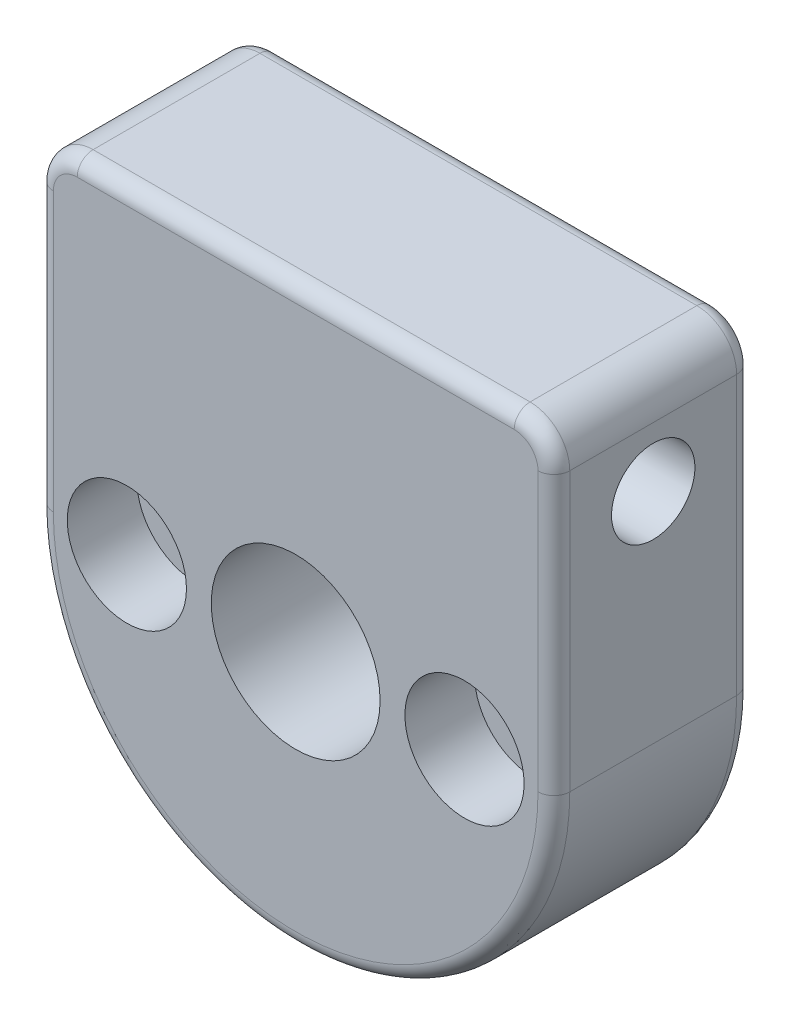
ISO-10303-21;
HEADER;
FILE_DESCRIPTION(('STEP AP214'),'2;1');
FILE_NAME('part.step','',(''),(''),'','','');
FILE_SCHEMA(('AUTOMOTIVE_DESIGN { 1 0 10303 214 1 1 1 1 }'));
ENDSEC;
DATA;
#1=APPLICATION_CONTEXT('core data for automotive mechanical design processes');
#2=APPLICATION_PROTOCOL_DEFINITION('international standard','automotive_design',2000,#1);
#3=PRODUCT_CONTEXT('',#1,'mechanical');
#4=PRODUCT('Part','Part','',(#3));
#5=PRODUCT_RELATED_PRODUCT_CATEGORY('part','',(#4));
#6=PRODUCT_DEFINITION_FORMATION('','',#4);
#7=PRODUCT_DEFINITION_CONTEXT('part definition',#1,'design');
#8=PRODUCT_DEFINITION('design','',#6,#7);
#9=PRODUCT_DEFINITION_SHAPE('','',#8);
#10=(LENGTH_UNIT() NAMED_UNIT(*) SI_UNIT(.MILLI.,.METRE.));
#11=(NAMED_UNIT(*) PLANE_ANGLE_UNIT() SI_UNIT($,.RADIAN.));
#12=(NAMED_UNIT(*) SI_UNIT($,.STERADIAN.) SOLID_ANGLE_UNIT());
#13=UNCERTAINTY_MEASURE_WITH_UNIT(LENGTH_MEASURE(1.E-05),#10,'distance_accuracy_value','');
#14=(GEOMETRIC_REPRESENTATION_CONTEXT(3) GLOBAL_UNCERTAINTY_ASSIGNED_CONTEXT((#13)) GLOBAL_UNIT_ASSIGNED_CONTEXT((#10,
#11,#12)) REPRESENTATION_CONTEXT('',''));
#15=CARTESIAN_POINT('',(0.,0.,0.));
#16=DIRECTION('',(0.,0.,1.));
#17=DIRECTION('',(1.,0.,0.));
#18=AXIS2_PLACEMENT_3D('',#15,#16,#17);
#19=CARTESIAN_POINT('',(-8.5,0.,10.));
#20=DIRECTION('',(0.,0.,-1.));
#21=DIRECTION('',(-1.,0.,0.));
#22=AXIS2_PLACEMENT_3D('',#19,#20,#21);
#23=CYLINDRICAL_SURFACE('',#22,1.6);
#24=CARTESIAN_POINT('',(-8.5,0.,0.));
#25=DIRECTION('',(0.,0.,1.));
#26=DIRECTION('',(1.,0.,0.));
#27=AXIS2_PLACEMENT_3D('',#24,#25,#26);
#28=CIRCLE('',#27,1.6);
#29=CARTESIAN_POINT('',(-6.9,0.,0.));
#30=VERTEX_POINT('',#29);
#31=EDGE_CURVE('E147',#30,#30,#28,.T.);
#32=ORIENTED_EDGE('',*,*,#31,.F.);
#33=EDGE_LOOP('',(#32));
#34=FACE_BOUND('',#33,.T.);
#35=CARTESIAN_POINT('',(-8.5,0.,6.5));
#36=DIRECTION('',(0.,0.,1.));
#37=DIRECTION('',(1.,0.,0.));
#38=AXIS2_PLACEMENT_3D('',#35,#36,#37);
#39=CIRCLE('',#38,1.6);
#40=CARTESIAN_POINT('',(-6.9,0.,6.5));
#41=VERTEX_POINT('',#40);
#42=EDGE_CURVE('E234',#41,#41,#39,.T.);
#43=ORIENTED_EDGE('',*,*,#42,.T.);
#44=EDGE_LOOP('',(#43));
#45=FACE_BOUND('',#44,.T.);
#46=ADVANCED_FACE('F34',(#34,#45),#23,.F.);
#47=CARTESIAN_POINT('',(8.5,0.,10.));
#48=DIRECTION('',(0.,0.,-1.));
#49=DIRECTION('',(-1.,0.,0.));
#50=AXIS2_PLACEMENT_3D('',#47,#48,#49);
#51=CYLINDRICAL_SURFACE('',#50,1.6);
#52=CARTESIAN_POINT('',(8.5,0.,0.));
#53=DIRECTION('',(0.,0.,1.));
#54=DIRECTION('',(-1.,0.,0.));
#55=AXIS2_PLACEMENT_3D('',#52,#53,#54);
#56=CIRCLE('',#55,1.6);
#57=CARTESIAN_POINT('',(6.9,0.,0.));
#58=VERTEX_POINT('',#57);
#59=EDGE_CURVE('E230',#58,#58,#56,.T.);
#60=ORIENTED_EDGE('',*,*,#59,.F.);
#61=EDGE_LOOP('',(#60));
#62=FACE_BOUND('',#61,.T.);
#63=CARTESIAN_POINT('',(8.5,0.,6.5));
#64=DIRECTION('',(0.,0.,1.));
#65=DIRECTION('',(1.,0.,0.));
#66=AXIS2_PLACEMENT_3D('',#63,#64,#65);
#67=CIRCLE('',#66,1.6);
#68=CARTESIAN_POINT('',(10.1,0.,6.5));
#69=VERTEX_POINT('',#68);
#70=EDGE_CURVE('E218',#69,#69,#67,.T.);
#71=ORIENTED_EDGE('',*,*,#70,.T.);
#72=EDGE_LOOP('',(#71));
#73=FACE_BOUND('',#72,.T.);
#74=ADVANCED_FACE('F329',(#62,#73),#51,.F.);
#75=CARTESIAN_POINT('',(0.,0.,10.));
#76=DIRECTION('',(0.,0.,1.));
#77=DIRECTION('',(1.,0.,0.));
#78=AXIS2_PLACEMENT_3D('',#75,#76,#77);
#79=PLANE('',#78);
#80=DIRECTION('',(0.,-1.,0.));
#81=VECTOR('',#80,1.);
#82=CARTESIAN_POINT('',(-12.2,0.,10.));
#83=LINE('',#82,#81);
#84=CARTESIAN_POINT('',(-12.2,14.,10.));
#85=VERTEX_POINT('',#84);
#86=CARTESIAN_POINT('',(-12.2,0.,10.));
#87=VERTEX_POINT('',#86);
#88=EDGE_CURVE('E51',#85,#87,#83,.T.);
#89=ORIENTED_EDGE('',*,*,#88,.T.);
#90=CARTESIAN_POINT('',(0.,0.,10.));
#91=DIRECTION('',(0.,0.,1.));
#92=DIRECTION('',(1.,0.,0.));
#93=AXIS2_PLACEMENT_3D('',#90,#91,#92);
#94=CIRCLE('',#93,12.2);
#95=CARTESIAN_POINT('',(12.2,0.,10.));
#96=VERTEX_POINT('',#95);
#97=EDGE_CURVE('E134',#87,#96,#94,.T.);
#98=ORIENTED_EDGE('',*,*,#97,.T.);
#99=DIRECTION('',(0.,1.,0.));
#100=VECTOR('',#99,1.);
#101=CARTESIAN_POINT('',(12.2,14.,10.));
#102=LINE('',#101,#100);
#103=CARTESIAN_POINT('',(12.2,14.,10.));
#104=VERTEX_POINT('',#103);
#105=EDGE_CURVE('E159',#96,#104,#102,.T.);
#106=ORIENTED_EDGE('',*,*,#105,.T.);
#107=CARTESIAN_POINT('',(11.,14.,10.));
#108=DIRECTION('',(0.,0.,1.));
#109=DIRECTION('',(1.,0.,0.));
#110=AXIS2_PLACEMENT_3D('',#107,#108,#109);
#111=CIRCLE('',#110,1.2);
#112=CARTESIAN_POINT('',(11.,15.2,10.));
#113=VERTEX_POINT('',#112);
#114=EDGE_CURVE('E284',#104,#113,#111,.T.);
#115=ORIENTED_EDGE('',*,*,#114,.T.);
#116=DIRECTION('',(-1.,0.,0.));
#117=VECTOR('',#116,1.);
#118=CARTESIAN_POINT('',(-11.,15.2,10.));
#119=LINE('',#118,#117);
#120=CARTESIAN_POINT('',(-11.,15.2,10.));
#121=VERTEX_POINT('',#120);
#122=EDGE_CURVE('E286',#113,#121,#119,.T.);
#123=ORIENTED_EDGE('',*,*,#122,.T.);
#124=CARTESIAN_POINT('',(-11.,14.,10.));
#125=DIRECTION('',(0.,0.,1.));
#126=DIRECTION('',(1.,0.,0.));
#127=AXIS2_PLACEMENT_3D('',#124,#125,#126);
#128=CIRCLE('',#127,1.2);
#129=EDGE_CURVE('E56',#121,#85,#128,.T.);
#130=ORIENTED_EDGE('',*,*,#129,.T.);
#131=EDGE_LOOP('',(#89,#98,#106,#115,#123,#130));
#132=FACE_BOUND('',#131,.T.);
#133=CARTESIAN_POINT('',(-8.5,0.,10.));
#134=DIRECTION('',(0.,0.,1.));
#135=DIRECTION('',(1.,0.,0.));
#136=AXIS2_PLACEMENT_3D('',#133,#134,#135);
#137=CIRCLE('',#136,3.);
#138=CARTESIAN_POINT('',(-5.5,0.,10.));
#139=VERTEX_POINT('',#138);
#140=EDGE_CURVE('E219',#139,#139,#137,.T.);
#141=ORIENTED_EDGE('',*,*,#140,.F.);
#142=EDGE_LOOP('',(#141));
#143=FACE_BOUND('',#142,.T.);
#144=CARTESIAN_POINT('',(8.5,0.,10.));
#145=DIRECTION('',(0.,0.,1.));
#146=DIRECTION('',(1.,0.,0.));
#147=AXIS2_PLACEMENT_3D('',#144,#145,#146);
#148=CIRCLE('',#147,3.);
#149=CARTESIAN_POINT('',(11.5,0.,10.));
#150=VERTEX_POINT('',#149);
#151=EDGE_CURVE('E212',#150,#150,#148,.T.);
#152=ORIENTED_EDGE('',*,*,#151,.F.);
#153=EDGE_LOOP('',(#152));
#154=FACE_BOUND('',#153,.T.);
#155=CARTESIAN_POINT('',(0.,0.,10.));
#156=DIRECTION('',(0.,0.,1.));
#157=DIRECTION('',(1.,0.,0.));
#158=AXIS2_PLACEMENT_3D('',#155,#156,#157);
#159=CIRCLE('',#158,4.25);
#160=CARTESIAN_POINT('',(4.25,0.,10.));
#161=VERTEX_POINT('',#160);
#162=EDGE_CURVE('E227',#161,#161,#159,.T.);
#163=ORIENTED_EDGE('',*,*,#162,.F.);
#164=EDGE_LOOP('',(#163));
#165=FACE_BOUND('',#164,.T.);
#166=ADVANCED_FACE('F290',(#132,#143,#154,#165),#79,.T.);
#167=CARTESIAN_POINT('',(0.,0.,0.));
#168=DIRECTION('',(0.,0.,1.));
#169=DIRECTION('',(1.,0.,0.));
#170=AXIS2_PLACEMENT_3D('',#167,#168,#169);
#171=PLANE('',#170);
#172=DIRECTION('',(0.,1.,0.));
#173=VECTOR('',#172,1.);
#174=CARTESIAN_POINT('',(12.2,0.,0.));
#175=LINE('',#174,#173);
#176=CARTESIAN_POINT('',(12.2,14.,0.));
#177=VERTEX_POINT('',#176);
#178=CARTESIAN_POINT('',(12.2,0.,0.));
#179=VERTEX_POINT('',#178);
#180=EDGE_CURVE('E254',#177,#179,#175,.F.);
#181=ORIENTED_EDGE('',*,*,#180,.T.);
#182=CARTESIAN_POINT('',(0.,0.,0.));
#183=DIRECTION('',(0.,0.,1.));
#184=DIRECTION('',(1.,0.,0.));
#185=AXIS2_PLACEMENT_3D('',#182,#183,#184);
#186=CIRCLE('',#185,12.2);
#187=CARTESIAN_POINT('',(-12.2,0.,0.));
#188=VERTEX_POINT('',#187);
#189=EDGE_CURVE('E264',#179,#188,#186,.F.);
#190=ORIENTED_EDGE('',*,*,#189,.T.);
#191=DIRECTION('',(0.,-1.,0.));
#192=VECTOR('',#191,1.);
#193=CARTESIAN_POINT('',(-12.2,0.,0.));
#194=LINE('',#193,#192);
#195=CARTESIAN_POINT('',(-12.2,14.,0.));
#196=VERTEX_POINT('',#195);
#197=EDGE_CURVE('E262',#188,#196,#194,.F.);
#198=ORIENTED_EDGE('',*,*,#197,.T.);
#199=CARTESIAN_POINT('',(-11.,14.,0.));
#200=DIRECTION('',(0.,0.,1.));
#201=DIRECTION('',(1.,0.,0.));
#202=AXIS2_PLACEMENT_3D('',#199,#200,#201);
#203=CIRCLE('',#202,1.2);
#204=CARTESIAN_POINT('',(-11.,15.2,0.));
#205=VERTEX_POINT('',#204);
#206=EDGE_CURVE('E260',#196,#205,#203,.F.);
#207=ORIENTED_EDGE('',*,*,#206,.T.);
#208=DIRECTION('',(-1.,0.,0.));
#209=VECTOR('',#208,1.);
#210=CARTESIAN_POINT('',(0.,15.2,0.));
#211=LINE('',#210,#209);
#212=CARTESIAN_POINT('',(11.,15.2,0.));
#213=VERTEX_POINT('',#212);
#214=EDGE_CURVE('E258',#205,#213,#211,.F.);
#215=ORIENTED_EDGE('',*,*,#214,.T.);
#216=CARTESIAN_POINT('',(11.,14.,0.));
#217=DIRECTION('',(0.,0.,1.));
#218=DIRECTION('',(1.,0.,0.));
#219=AXIS2_PLACEMENT_3D('',#216,#217,#218);
#220=CIRCLE('',#219,1.2);
#221=EDGE_CURVE('E256',#213,#177,#220,.F.);
#222=ORIENTED_EDGE('',*,*,#221,.T.);
#223=EDGE_LOOP('',(#181,#190,#198,#207,#215,#222));
#224=FACE_BOUND('',#223,.T.);
#225=ORIENTED_EDGE('',*,*,#31,.T.);
#226=EDGE_LOOP('',(#225));
#227=FACE_BOUND('',#226,.T.);
#228=ORIENTED_EDGE('',*,*,#59,.T.);
#229=EDGE_LOOP('',(#228));
#230=FACE_BOUND('',#229,.T.);
#231=CARTESIAN_POINT('',(0.,0.,0.));
#232=DIRECTION('',(0.,0.,1.));
#233=DIRECTION('',(1.,0.,0.));
#234=AXIS2_PLACEMENT_3D('',#231,#232,#233);
#235=CIRCLE('',#234,4.25);
#236=CARTESIAN_POINT('',(4.25,0.,0.));
#237=VERTEX_POINT('',#236);
#238=EDGE_CURVE('E231',#237,#237,#235,.T.);
#239=ORIENTED_EDGE('',*,*,#238,.T.);
#240=EDGE_LOOP('',(#239));
#241=FACE_BOUND('',#240,.T.);
#242=ADVANCED_FACE('F343',(#224,#227,#230,#241),#171,.F.);
#243=CARTESIAN_POINT('',(-13.,16.,10.));
#244=DIRECTION('',(1.,0.,0.));
#245=DIRECTION('',(0.,1.,0.));
#246=AXIS2_PLACEMENT_3D('',#243,#244,#245);
#247=PLANE('',#246);
#248=CARTESIAN_POINT('',(-13.,11.,5.));
#249=DIRECTION('',(-1.,0.,0.));
#250=DIRECTION('',(0.,-1.,0.));
#251=AXIS2_PLACEMENT_3D('',#248,#249,#250);
#252=CIRCLE('',#251,2.1);
#253=CARTESIAN_POINT('',(-13.,8.9,5.));
#254=VERTEX_POINT('',#253);
#255=EDGE_CURVE('E201',#254,#254,#252,.T.);
#256=ORIENTED_EDGE('',*,*,#255,.F.);
#257=EDGE_LOOP('',(#256));
#258=FACE_BOUND('',#257,.T.);
#259=DIRECTION('',(0.,0.,-1.));
#260=VECTOR('',#259,1.);
#261=CARTESIAN_POINT('',(-13.,14.,10.));
#262=LINE('',#261,#260);
#263=CARTESIAN_POINT('',(-13.,14.,9.2));
#264=VERTEX_POINT('',#263);
#265=CARTESIAN_POINT('',(-13.,14.,0.8));
#266=VERTEX_POINT('',#265);
#267=EDGE_CURVE('E156',#264,#266,#262,.T.);
#268=ORIENTED_EDGE('',*,*,#267,.T.);
#269=DIRECTION('',(0.,-1.,0.));
#270=VECTOR('',#269,1.);
#271=CARTESIAN_POINT('',(-13.,16.,0.8));
#272=LINE('',#271,#270);
#273=CARTESIAN_POINT('',(-13.,0.,0.8));
#274=VERTEX_POINT('',#273);
#275=EDGE_CURVE('E269',#266,#274,#272,.T.);
#276=ORIENTED_EDGE('',*,*,#275,.T.);
#277=DIRECTION('',(0.,0.,-1.));
#278=VECTOR('',#277,1.);
#279=CARTESIAN_POINT('',(-13.,0.,10.));
#280=LINE('',#279,#278);
#281=CARTESIAN_POINT('',(-13.,0.,9.2));
#282=VERTEX_POINT('',#281);
#283=EDGE_CURVE('E146',#282,#274,#280,.T.);
#284=ORIENTED_EDGE('',*,*,#283,.F.);
#285=DIRECTION('',(0.,-1.,0.));
#286=VECTOR('',#285,1.);
#287=CARTESIAN_POINT('',(-13.,14.,9.2));
#288=LINE('',#287,#286);
#289=EDGE_CURVE('E267',#282,#264,#288,.F.);
#290=ORIENTED_EDGE('',*,*,#289,.T.);
#291=EDGE_LOOP('',(#268,#276,#284,#290));
#292=FACE_BOUND('',#291,.T.);
#293=ADVANCED_FACE('F306',(#258,#292),#247,.F.);
#294=CARTESIAN_POINT('',(0.,0.,10.));
#295=DIRECTION('',(0.,0.,-1.));
#296=DIRECTION('',(-1.,0.,0.));
#297=AXIS2_PLACEMENT_3D('',#294,#295,#296);
#298=CYLINDRICAL_SURFACE('',#297,13.);
#299=ORIENTED_EDGE('',*,*,#283,.T.);
#300=CARTESIAN_POINT('',(0.,0.,0.8));
#301=DIRECTION('',(0.,0.,1.));
#302=DIRECTION('',(1.,0.,0.));
#303=AXIS2_PLACEMENT_3D('',#300,#301,#302);
#304=CIRCLE('',#303,13.);
#305=CARTESIAN_POINT('',(13.,0.,0.8));
#306=VERTEX_POINT('',#305);
#307=EDGE_CURVE('E145',#274,#306,#304,.T.);
#308=ORIENTED_EDGE('',*,*,#307,.T.);
#309=DIRECTION('',(0.,0.,-1.));
#310=VECTOR('',#309,1.);
#311=CARTESIAN_POINT('',(13.,0.,10.));
#312=LINE('',#311,#310);
#313=CARTESIAN_POINT('',(13.,0.,9.2));
#314=VERTEX_POINT('',#313);
#315=EDGE_CURVE('E127',#314,#306,#312,.T.);
#316=ORIENTED_EDGE('',*,*,#315,.F.);
#317=CARTESIAN_POINT('',(0.,0.,9.2));
#318=DIRECTION('',(0.,0.,1.));
#319=DIRECTION('',(1.,0.,0.));
#320=AXIS2_PLACEMENT_3D('',#317,#318,#319);
#321=CIRCLE('',#320,13.);
#322=EDGE_CURVE('E142',#314,#282,#321,.F.);
#323=ORIENTED_EDGE('',*,*,#322,.T.);
#324=EDGE_LOOP('',(#299,#308,#316,#323));
#325=FACE_BOUND('',#324,.T.);
#326=ADVANCED_FACE('F141',(#325),#298,.T.);
#327=CARTESIAN_POINT('',(13.,16.,10.));
#328=DIRECTION('',(-1.,0.,0.));
#329=DIRECTION('',(0.,-1.,0.));
#330=AXIS2_PLACEMENT_3D('',#327,#328,#329);
#331=PLANE('',#330);
#332=CARTESIAN_POINT('',(13.,11.,5.));
#333=DIRECTION('',(-1.,0.,0.));
#334=DIRECTION('',(0.,-1.,0.));
#335=AXIS2_PLACEMENT_3D('',#332,#333,#334);
#336=CIRCLE('',#335,2.1);
#337=CARTESIAN_POINT('',(13.,8.9,5.));
#338=VERTEX_POINT('',#337);
#339=EDGE_CURVE('E207',#338,#338,#336,.T.);
#340=ORIENTED_EDGE('',*,*,#339,.T.);
#341=EDGE_LOOP('',(#340));
#342=FACE_BOUND('',#341,.T.);
#343=ORIENTED_EDGE('',*,*,#315,.T.);
#344=DIRECTION('',(0.,1.,0.));
#345=VECTOR('',#344,1.);
#346=CARTESIAN_POINT('',(13.,16.,0.8));
#347=LINE('',#346,#345);
#348=CARTESIAN_POINT('',(13.,14.,0.8));
#349=VERTEX_POINT('',#348);
#350=EDGE_CURVE('E11',#306,#349,#347,.T.);
#351=ORIENTED_EDGE('',*,*,#350,.T.);
#352=DIRECTION('',(0.,0.,-1.));
#353=VECTOR('',#352,1.);
#354=CARTESIAN_POINT('',(13.,14.,10.));
#355=LINE('',#354,#353);
#356=CARTESIAN_POINT('',(13.,14.,9.2));
#357=VERTEX_POINT('',#356);
#358=EDGE_CURVE('E129',#349,#357,#355,.F.);
#359=ORIENTED_EDGE('',*,*,#358,.T.);
#360=DIRECTION('',(0.,1.,0.));
#361=VECTOR('',#360,1.);
#362=CARTESIAN_POINT('',(13.,0.,9.2));
#363=LINE('',#362,#361);
#364=EDGE_CURVE('E43',#357,#314,#363,.F.);
#365=ORIENTED_EDGE('',*,*,#364,.T.);
#366=EDGE_LOOP('',(#343,#351,#359,#365));
#367=FACE_BOUND('',#366,.T.);
#368=ADVANCED_FACE('F126',(#342,#367),#331,.F.);
#369=CARTESIAN_POINT('',(-13.,16.,10.));
#370=DIRECTION('',(0.,-1.,0.));
#371=DIRECTION('',(0.,0.,-1.));
#372=AXIS2_PLACEMENT_3D('',#369,#370,#371);
#373=PLANE('',#372);
#374=DIRECTION('',(0.,0.,-1.));
#375=VECTOR('',#374,1.);
#376=CARTESIAN_POINT('',(11.,16.,10.));
#377=LINE('',#376,#375);
#378=CARTESIAN_POINT('',(11.,16.,9.2));
#379=VERTEX_POINT('',#378);
#380=CARTESIAN_POINT('',(11.,16.,0.8));
#381=VERTEX_POINT('',#380);
#382=EDGE_CURVE('E247',#379,#381,#377,.T.);
#383=ORIENTED_EDGE('',*,*,#382,.T.);
#384=DIRECTION('',(-1.,0.,0.));
#385=VECTOR('',#384,1.);
#386=CARTESIAN_POINT('',(-13.,16.,0.8));
#387=LINE('',#386,#385);
#388=CARTESIAN_POINT('',(-11.,16.,0.8));
#389=VERTEX_POINT('',#388);
#390=EDGE_CURVE('E277',#381,#389,#387,.T.);
#391=ORIENTED_EDGE('',*,*,#390,.T.);
#392=DIRECTION('',(0.,0.,-1.));
#393=VECTOR('',#392,1.);
#394=CARTESIAN_POINT('',(-11.,16.,10.));
#395=LINE('',#394,#393);
#396=CARTESIAN_POINT('',(-11.,16.,9.2));
#397=VERTEX_POINT('',#396);
#398=EDGE_CURVE('E240',#389,#397,#395,.F.);
#399=ORIENTED_EDGE('',*,*,#398,.T.);
#400=DIRECTION('',(-1.,0.,0.));
#401=VECTOR('',#400,1.);
#402=CARTESIAN_POINT('',(11.,16.,9.2));
#403=LINE('',#402,#401);
#404=EDGE_CURVE('E275',#397,#379,#403,.F.);
#405=ORIENTED_EDGE('',*,*,#404,.T.);
#406=EDGE_LOOP('',(#383,#391,#399,#405));
#407=FACE_BOUND('',#406,.T.);
#408=ADVANCED_FACE('F347',(#407),#373,.F.);
#409=CARTESIAN_POINT('',(0.,0.,10.));
#410=DIRECTION('',(0.,0.,-1.));
#411=DIRECTION('',(-1.,0.,0.));
#412=AXIS2_PLACEMENT_3D('',#409,#410,#411);
#413=CYLINDRICAL_SURFACE('',#412,4.25);
#414=ORIENTED_EDGE('',*,*,#162,.T.);
#415=EDGE_LOOP('',(#414));
#416=FACE_BOUND('',#415,.T.);
#417=ORIENTED_EDGE('',*,*,#238,.F.);
#418=EDGE_LOOP('',(#417));
#419=FACE_BOUND('',#418,.T.);
#420=ADVANCED_FACE('F350',(#416,#419),#413,.F.);
#421=CARTESIAN_POINT('',(8.5,0.,6.5));
#422=DIRECTION('',(0.,0.,1.));
#423=DIRECTION('',(1.,0.,0.));
#424=AXIS2_PLACEMENT_3D('',#421,#422,#423);
#425=CYLINDRICAL_SURFACE('',#424,3.);
#426=CARTESIAN_POINT('',(8.5,0.,6.5));
#427=DIRECTION('',(0.,0.,1.));
#428=DIRECTION('',(1.,0.,0.));
#429=AXIS2_PLACEMENT_3D('',#426,#427,#428);
#430=CIRCLE('',#429,3.);
#431=CARTESIAN_POINT('',(11.5,0.,6.5));
#432=VERTEX_POINT('',#431);
#433=EDGE_CURVE('E222',#432,#432,#430,.T.);
#434=ORIENTED_EDGE('',*,*,#433,.F.);
#435=EDGE_LOOP('',(#434));
#436=FACE_BOUND('',#435,.T.);
#437=ORIENTED_EDGE('',*,*,#151,.T.);
#438=EDGE_LOOP('',(#437));
#439=FACE_BOUND('',#438,.T.);
#440=ADVANCED_FACE('F502',(#436,#439),#425,.F.);
#441=CARTESIAN_POINT('',(8.5,0.,6.5));
#442=DIRECTION('',(0.,0.,1.));
#443=DIRECTION('',(1.,0.,0.));
#444=AXIS2_PLACEMENT_3D('',#441,#442,#443);
#445=PLANE('',#444);
#446=ORIENTED_EDGE('',*,*,#70,.F.);
#447=EDGE_LOOP('',(#446));
#448=FACE_BOUND('',#447,.T.);
#449=ORIENTED_EDGE('',*,*,#433,.T.);
#450=EDGE_LOOP('',(#449));
#451=FACE_BOUND('',#450,.T.);
#452=ADVANCED_FACE('F493',(#448,#451),#445,.T.);
#453=CARTESIAN_POINT('',(-8.5,0.,6.5));
#454=DIRECTION('',(0.,0.,1.));
#455=DIRECTION('',(1.,0.,0.));
#456=AXIS2_PLACEMENT_3D('',#453,#454,#455);
#457=CYLINDRICAL_SURFACE('',#456,3.);
#458=CARTESIAN_POINT('',(-8.5,0.,6.5));
#459=DIRECTION('',(0.,0.,1.));
#460=DIRECTION('',(1.,0.,0.));
#461=AXIS2_PLACEMENT_3D('',#458,#459,#460);
#462=CIRCLE('',#461,3.);
#463=CARTESIAN_POINT('',(-5.5,0.,6.5));
#464=VERTEX_POINT('',#463);
#465=EDGE_CURVE('E215',#464,#464,#462,.T.);
#466=ORIENTED_EDGE('',*,*,#465,.F.);
#467=EDGE_LOOP('',(#466));
#468=FACE_BOUND('',#467,.T.);
#469=ORIENTED_EDGE('',*,*,#140,.T.);
#470=EDGE_LOOP('',(#469));
#471=FACE_BOUND('',#470,.T.);
#472=ADVANCED_FACE('F484',(#468,#471),#457,.F.);
#473=CARTESIAN_POINT('',(-8.5,0.,6.5));
#474=DIRECTION('',(0.,0.,1.));
#475=DIRECTION('',(1.,0.,0.));
#476=AXIS2_PLACEMENT_3D('',#473,#474,#475);
#477=PLANE('',#476);
#478=ORIENTED_EDGE('',*,*,#42,.F.);
#479=EDGE_LOOP('',(#478));
#480=FACE_BOUND('',#479,.T.);
#481=ORIENTED_EDGE('',*,*,#465,.T.);
#482=EDGE_LOOP('',(#481));
#483=FACE_BOUND('',#482,.T.);
#484=ADVANCED_FACE('F474',(#480,#483),#477,.T.);
#485=CARTESIAN_POINT('',(13.,11.,5.));
#486=DIRECTION('',(-1.,0.,0.));
#487=DIRECTION('',(0.,-1.,0.));
#488=AXIS2_PLACEMENT_3D('',#485,#486,#487);
#489=CYLINDRICAL_SURFACE('',#488,2.1);
#490=ORIENTED_EDGE('',*,*,#339,.F.);
#491=EDGE_LOOP('',(#490));
#492=FACE_BOUND('',#491,.T.);
#493=ORIENTED_EDGE('',*,*,#255,.T.);
#494=EDGE_LOOP('',(#493));
#495=FACE_BOUND('',#494,.T.);
#496=ADVANCED_FACE('F360',(#492,#495),#489,.F.);
#497=CARTESIAN_POINT('',(11.,14.,10.));
#498=DIRECTION('',(0.,0.,-1.));
#499=DIRECTION('',(-1.,0.,0.));
#500=AXIS2_PLACEMENT_3D('',#497,#498,#499);
#501=CYLINDRICAL_SURFACE('',#500,2.);
#502=ORIENTED_EDGE('',*,*,#358,.F.);
#503=CARTESIAN_POINT('',(11.,14.,0.8));
#504=DIRECTION('',(0.,0.,1.));
#505=DIRECTION('',(1.,0.,0.));
#506=AXIS2_PLACEMENT_3D('',#503,#504,#505);
#507=CIRCLE('',#506,2.);
#508=EDGE_CURVE('E281',#349,#381,#507,.T.);
#509=ORIENTED_EDGE('',*,*,#508,.T.);
#510=ORIENTED_EDGE('',*,*,#382,.F.);
#511=CARTESIAN_POINT('',(11.,14.,9.2));
#512=DIRECTION('',(0.,0.,1.));
#513=DIRECTION('',(1.,0.,0.));
#514=AXIS2_PLACEMENT_3D('',#511,#512,#513);
#515=CIRCLE('',#514,2.);
#516=EDGE_CURVE('E279',#379,#357,#515,.F.);
#517=ORIENTED_EDGE('',*,*,#516,.T.);
#518=EDGE_LOOP('',(#502,#509,#510,#517));
#519=FACE_BOUND('',#518,.T.);
#520=ADVANCED_FACE('F296',(#519),#501,.T.);
#521=CARTESIAN_POINT('',(-11.,14.,10.));
#522=DIRECTION('',(0.,0.,-1.));
#523=DIRECTION('',(-1.,0.,0.));
#524=AXIS2_PLACEMENT_3D('',#521,#522,#523);
#525=CYLINDRICAL_SURFACE('',#524,2.);
#526=ORIENTED_EDGE('',*,*,#398,.F.);
#527=CARTESIAN_POINT('',(-11.,14.,0.8));
#528=DIRECTION('',(0.,0.,1.));
#529=DIRECTION('',(1.,0.,0.));
#530=AXIS2_PLACEMENT_3D('',#527,#528,#529);
#531=CIRCLE('',#530,2.);
#532=EDGE_CURVE('E273',#389,#266,#531,.T.);
#533=ORIENTED_EDGE('',*,*,#532,.T.);
#534=ORIENTED_EDGE('',*,*,#267,.F.);
#535=CARTESIAN_POINT('',(-11.,14.,9.2));
#536=DIRECTION('',(0.,0.,1.));
#537=DIRECTION('',(1.,0.,0.));
#538=AXIS2_PLACEMENT_3D('',#535,#536,#537);
#539=CIRCLE('',#538,2.);
#540=EDGE_CURVE('E271',#264,#397,#539,.F.);
#541=ORIENTED_EDGE('',*,*,#540,.T.);
#542=EDGE_LOOP('',(#526,#533,#534,#541));
#543=FACE_BOUND('',#542,.T.);
#544=ADVANCED_FACE('F310',(#543),#525,.T.);
#545=CARTESIAN_POINT('',(-13.,15.2,0.8));
#546=DIRECTION('',(-1.,0.,0.));
#547=DIRECTION('',(0.,0.,1.));
#548=AXIS2_PLACEMENT_3D('',#545,#546,#547);
#549=CYLINDRICAL_SURFACE('',#548,0.8);
#550=CARTESIAN_POINT('',(11.,15.2,0.8));
#551=DIRECTION('',(1.,0.,0.));
#552=DIRECTION('',(0.,0.,-1.));
#553=AXIS2_PLACEMENT_3D('',#550,#551,#552);
#554=CIRCLE('',#553,0.8);
#555=EDGE_CURVE('E194',#213,#381,#554,.T.);
#556=ORIENTED_EDGE('',*,*,#555,.F.);
#557=ORIENTED_EDGE('',*,*,#214,.F.);
#558=CARTESIAN_POINT('',(-11.,15.2,0.8));
#559=DIRECTION('',(-1.,0.,0.));
#560=DIRECTION('',(0.,0.,1.));
#561=AXIS2_PLACEMENT_3D('',#558,#559,#560);
#562=CIRCLE('',#561,0.8);
#563=EDGE_CURVE('E164',#389,#205,#562,.T.);
#564=ORIENTED_EDGE('',*,*,#563,.F.);
#565=ORIENTED_EDGE('',*,*,#390,.F.);
#566=EDGE_LOOP('',(#556,#557,#564,#565));
#567=FACE_BOUND('',#566,.T.);
#568=ADVANCED_FACE('F362',(#567),#549,.T.);
#569=CARTESIAN_POINT('',(-11.,14.,0.8));
#570=DIRECTION('',(0.,0.,1.));
#571=DIRECTION('',(1.,0.,0.));
#572=AXIS2_PLACEMENT_3D('',#569,#570,#571);
#573=TOROIDAL_SURFACE('',#572,1.2,0.8);
#574=ORIENTED_EDGE('',*,*,#563,.T.);
#575=ORIENTED_EDGE('',*,*,#206,.F.);
#576=CARTESIAN_POINT('',(-12.2,14.,0.8));
#577=DIRECTION('',(0.,-1.,0.));
#578=DIRECTION('',(0.,0.,-1.));
#579=AXIS2_PLACEMENT_3D('',#576,#577,#578);
#580=CIRCLE('',#579,0.8);
#581=EDGE_CURVE('E192',#266,#196,#580,.T.);
#582=ORIENTED_EDGE('',*,*,#581,.F.);
#583=ORIENTED_EDGE('',*,*,#532,.F.);
#584=EDGE_LOOP('',(#574,#575,#582,#583));
#585=FACE_BOUND('',#584,.T.);
#586=ADVANCED_FACE('F311',(#585),#573,.T.);
#587=CARTESIAN_POINT('',(11.,14.,0.8));
#588=DIRECTION('',(0.,0.,1.));
#589=DIRECTION('',(1.,0.,0.));
#590=AXIS2_PLACEMENT_3D('',#587,#588,#589);
#591=TOROIDAL_SURFACE('',#590,1.2,0.8);
#592=ORIENTED_EDGE('',*,*,#555,.T.);
#593=ORIENTED_EDGE('',*,*,#508,.F.);
#594=CARTESIAN_POINT('',(12.2,14.,0.8));
#595=DIRECTION('',(0.,-1.,0.));
#596=DIRECTION('',(0.,0.,-1.));
#597=AXIS2_PLACEMENT_3D('',#594,#595,#596);
#598=CIRCLE('',#597,0.8);
#599=EDGE_CURVE('E187',#177,#349,#598,.T.);
#600=ORIENTED_EDGE('',*,*,#599,.F.);
#601=ORIENTED_EDGE('',*,*,#221,.F.);
#602=EDGE_LOOP('',(#592,#593,#600,#601));
#603=FACE_BOUND('',#602,.T.);
#604=ADVANCED_FACE('F371',(#603),#591,.T.);
#605=CARTESIAN_POINT('',(-12.2,16.,0.8));
#606=DIRECTION('',(0.,-1.,0.));
#607=DIRECTION('',(1.,0.,0.));
#608=AXIS2_PLACEMENT_3D('',#605,#606,#607);
#609=CYLINDRICAL_SURFACE('',#608,0.8);
#610=ORIENTED_EDGE('',*,*,#581,.T.);
#611=ORIENTED_EDGE('',*,*,#197,.F.);
#612=CARTESIAN_POINT('',(-12.2,0.,0.8));
#613=DIRECTION('',(0.,-1.,0.));
#614=DIRECTION('',(0.,0.,-1.));
#615=AXIS2_PLACEMENT_3D('',#612,#613,#614);
#616=CIRCLE('',#615,0.8);
#617=EDGE_CURVE('E181',#274,#188,#616,.T.);
#618=ORIENTED_EDGE('',*,*,#617,.F.);
#619=ORIENTED_EDGE('',*,*,#275,.F.);
#620=EDGE_LOOP('',(#610,#611,#618,#619));
#621=FACE_BOUND('',#620,.T.);
#622=ADVANCED_FACE('F316',(#621),#609,.T.);
#623=CARTESIAN_POINT('',(12.2,16.,0.8));
#624=DIRECTION('',(0.,1.,0.));
#625=DIRECTION('',(-1.,0.,0.));
#626=AXIS2_PLACEMENT_3D('',#623,#624,#625);
#627=CYLINDRICAL_SURFACE('',#626,0.8);
#628=ORIENTED_EDGE('',*,*,#599,.T.);
#629=ORIENTED_EDGE('',*,*,#350,.F.);
#630=CARTESIAN_POINT('',(12.2,0.,0.8));
#631=DIRECTION('',(0.,-1.,0.));
#632=DIRECTION('',(0.,0.,-1.));
#633=AXIS2_PLACEMENT_3D('',#630,#631,#632);
#634=CIRCLE('',#633,0.8);
#635=EDGE_CURVE('E177',#179,#306,#634,.T.);
#636=ORIENTED_EDGE('',*,*,#635,.F.);
#637=ORIENTED_EDGE('',*,*,#180,.F.);
#638=EDGE_LOOP('',(#628,#629,#636,#637));
#639=FACE_BOUND('',#638,.T.);
#640=ADVANCED_FACE('F319',(#639),#627,.T.);
#641=CARTESIAN_POINT('',(0.,0.,0.8));
#642=DIRECTION('',(0.,0.,1.));
#643=DIRECTION('',(1.,0.,0.));
#644=AXIS2_PLACEMENT_3D('',#641,#642,#643);
#645=TOROIDAL_SURFACE('',#644,12.2,0.8);
#646=ORIENTED_EDGE('',*,*,#617,.T.);
#647=ORIENTED_EDGE('',*,*,#189,.F.);
#648=ORIENTED_EDGE('',*,*,#635,.T.);
#649=ORIENTED_EDGE('',*,*,#307,.F.);
#650=EDGE_LOOP('',(#646,#647,#648,#649));
#651=FACE_BOUND('',#650,.T.);
#652=ADVANCED_FACE('F317',(#651),#645,.T.);
#653=CARTESIAN_POINT('',(0.,15.2,9.2));
#654=DIRECTION('',(1.,0.,0.));
#655=DIRECTION('',(0.,0.,-1.));
#656=AXIS2_PLACEMENT_3D('',#653,#654,#655);
#657=CYLINDRICAL_SURFACE('',#656,0.8);
#658=CARTESIAN_POINT('',(11.,15.2,9.2));
#659=DIRECTION('',(1.,0.,0.));
#660=DIRECTION('',(0.,0.,-1.));
#661=AXIS2_PLACEMENT_3D('',#658,#659,#660);
#662=CIRCLE('',#661,0.8);
#663=EDGE_CURVE('E170',#379,#113,#662,.T.);
#664=ORIENTED_EDGE('',*,*,#663,.F.);
#665=ORIENTED_EDGE('',*,*,#404,.F.);
#666=CARTESIAN_POINT('',(-11.,15.2,9.2));
#667=DIRECTION('',(-1.,0.,0.));
#668=DIRECTION('',(0.,0.,1.));
#669=AXIS2_PLACEMENT_3D('',#666,#667,#668);
#670=CIRCLE('',#669,0.8);
#671=EDGE_CURVE('E38',#121,#397,#670,.T.);
#672=ORIENTED_EDGE('',*,*,#671,.F.);
#673=ORIENTED_EDGE('',*,*,#122,.F.);
#674=EDGE_LOOP('',(#664,#665,#672,#673));
#675=FACE_BOUND('',#674,.T.);
#676=ADVANCED_FACE('F36',(#675),#657,.T.);
#677=CARTESIAN_POINT('',(-11.,14.,9.2));
#678=DIRECTION('',(0.,0.,1.));
#679=DIRECTION('',(1.,0.,0.));
#680=AXIS2_PLACEMENT_3D('',#677,#678,#679);
#681=TOROIDAL_SURFACE('',#680,1.2,0.8);
#682=ORIENTED_EDGE('',*,*,#671,.T.);
#683=ORIENTED_EDGE('',*,*,#540,.F.);
#684=CARTESIAN_POINT('',(-12.2,14.,9.2));
#685=DIRECTION('',(0.,-1.,0.));
#686=DIRECTION('',(0.,0.,-1.));
#687=AXIS2_PLACEMENT_3D('',#684,#685,#686);
#688=CIRCLE('',#687,0.8);
#689=EDGE_CURVE('E168',#85,#264,#688,.T.);
#690=ORIENTED_EDGE('',*,*,#689,.F.);
#691=ORIENTED_EDGE('',*,*,#129,.F.);
#692=EDGE_LOOP('',(#682,#683,#690,#691));
#693=FACE_BOUND('',#692,.T.);
#694=ADVANCED_FACE('F301',(#693),#681,.T.);
#695=CARTESIAN_POINT('',(11.,14.,9.2));
#696=DIRECTION('',(0.,0.,1.));
#697=DIRECTION('',(1.,0.,0.));
#698=AXIS2_PLACEMENT_3D('',#695,#696,#697);
#699=TOROIDAL_SURFACE('',#698,1.2,0.8);
#700=ORIENTED_EDGE('',*,*,#663,.T.);
#701=ORIENTED_EDGE('',*,*,#114,.F.);
#702=CARTESIAN_POINT('',(12.2,14.,9.2));
#703=DIRECTION('',(0.,-1.,0.));
#704=DIRECTION('',(0.,0.,-1.));
#705=AXIS2_PLACEMENT_3D('',#702,#703,#704);
#706=CIRCLE('',#705,0.8);
#707=EDGE_CURVE('E161',#357,#104,#706,.T.);
#708=ORIENTED_EDGE('',*,*,#707,.F.);
#709=ORIENTED_EDGE('',*,*,#516,.F.);
#710=EDGE_LOOP('',(#700,#701,#708,#709));
#711=FACE_BOUND('',#710,.T.);
#712=ADVANCED_FACE('F293',(#711),#699,.T.);
#713=CARTESIAN_POINT('',(-12.2,0.,9.2));
#714=DIRECTION('',(0.,1.,0.));
#715=DIRECTION('',(-1.,0.,0.));
#716=AXIS2_PLACEMENT_3D('',#713,#714,#715);
#717=CYLINDRICAL_SURFACE('',#716,0.8);
#718=ORIENTED_EDGE('',*,*,#689,.T.);
#719=ORIENTED_EDGE('',*,*,#289,.F.);
#720=CARTESIAN_POINT('',(-12.2,0.,9.2));
#721=DIRECTION('',(0.,-1.,0.));
#722=DIRECTION('',(1.,0.,0.));
#723=AXIS2_PLACEMENT_3D('',#720,#721,#722);
#724=CIRCLE('',#723,0.8);
#725=EDGE_CURVE('E154',#87,#282,#724,.T.);
#726=ORIENTED_EDGE('',*,*,#725,.F.);
#727=ORIENTED_EDGE('',*,*,#88,.F.);
#728=EDGE_LOOP('',(#718,#719,#726,#727));
#729=FACE_BOUND('',#728,.T.);
#730=ADVANCED_FACE('F303',(#729),#717,.T.);
#731=CARTESIAN_POINT('',(12.2,0.,9.2));
#732=DIRECTION('',(0.,-1.,0.));
#733=DIRECTION('',(1.,0.,0.));
#734=AXIS2_PLACEMENT_3D('',#731,#732,#733);
#735=CYLINDRICAL_SURFACE('',#734,0.8);
#736=ORIENTED_EDGE('',*,*,#707,.T.);
#737=ORIENTED_EDGE('',*,*,#105,.F.);
#738=CARTESIAN_POINT('',(12.2,0.,9.2));
#739=DIRECTION('',(0.,-1.,0.));
#740=DIRECTION('',(0.,0.,-1.));
#741=AXIS2_PLACEMENT_3D('',#738,#739,#740);
#742=CIRCLE('',#741,0.8);
#743=EDGE_CURVE('E152',#314,#96,#742,.T.);
#744=ORIENTED_EDGE('',*,*,#743,.F.);
#745=ORIENTED_EDGE('',*,*,#364,.F.);
#746=EDGE_LOOP('',(#736,#737,#744,#745));
#747=FACE_BOUND('',#746,.T.);
#748=ADVANCED_FACE('F158',(#747),#735,.T.);
#749=CARTESIAN_POINT('',(0.,0.,9.2));
#750=DIRECTION('',(0.,0.,1.));
#751=DIRECTION('',(1.,0.,0.));
#752=AXIS2_PLACEMENT_3D('',#749,#750,#751);
#753=TOROIDAL_SURFACE('',#752,12.2,0.8);
#754=ORIENTED_EDGE('',*,*,#725,.T.);
#755=ORIENTED_EDGE('',*,*,#322,.F.);
#756=ORIENTED_EDGE('',*,*,#743,.T.);
#757=ORIENTED_EDGE('',*,*,#97,.F.);
#758=EDGE_LOOP('',(#754,#755,#756,#757));
#759=FACE_BOUND('',#758,.T.);
#760=ADVANCED_FACE('F150',(#759),#753,.T.);
#761=CLOSED_SHELL('',(#46,#74,#166,#242,#293,#326,#368,#408,#420,#440,#452,#472,#484,#496,#520,
#544,#568,#586,#604,#622,#640,#652,#676,#694,#712,#730,#748,#760));
#762=MANIFOLD_SOLID_BREP('B2',#761);
#763=ADVANCED_BREP_SHAPE_REPRESENTATION('',(#18,#762),#14);
#764=SHAPE_DEFINITION_REPRESENTATION(#9,#763);
ENDSEC;
END-ISO-10303-21;
